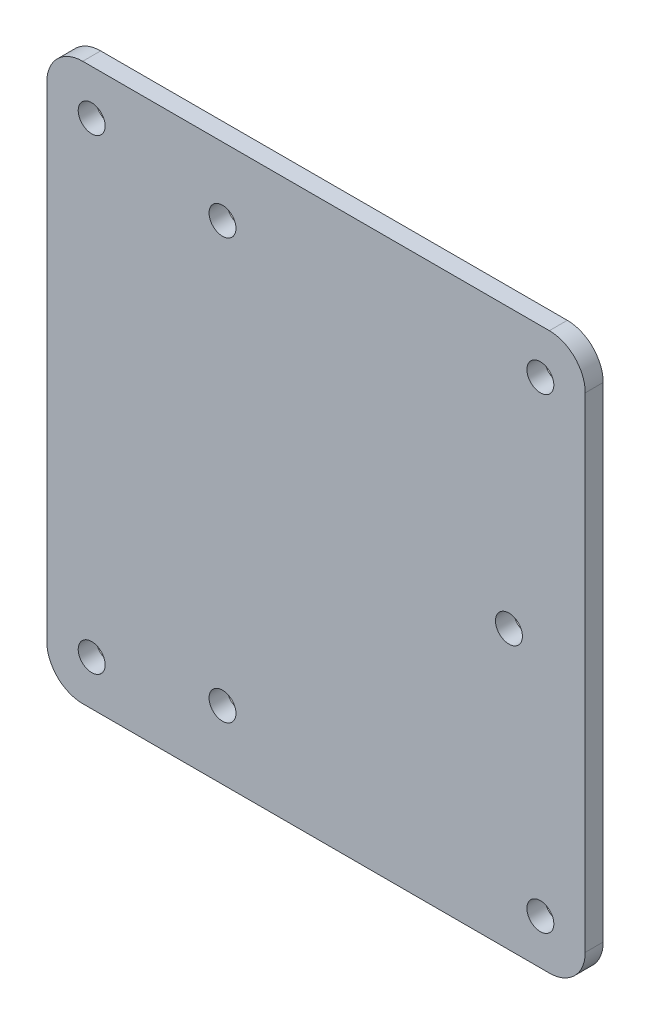
ISO-10303-21;
HEADER;
FILE_DESCRIPTION(('STEP AP214'),'2;1');
FILE_NAME('part.step','',(''),(''),'','','');
FILE_SCHEMA(('AUTOMOTIVE_DESIGN { 1 0 10303 214 1 1 1 1 }'));
ENDSEC;
DATA;
#1=APPLICATION_CONTEXT('core data for automotive mechanical design processes');
#2=APPLICATION_PROTOCOL_DEFINITION('international standard','automotive_design',2000,#1);
#3=PRODUCT_CONTEXT('',#1,'mechanical');
#4=PRODUCT('Part','Part','',(#3));
#5=PRODUCT_RELATED_PRODUCT_CATEGORY('part','',(#4));
#6=PRODUCT_DEFINITION_FORMATION('','',#4);
#7=PRODUCT_DEFINITION_CONTEXT('part definition',#1,'design');
#8=PRODUCT_DEFINITION('design','',#6,#7);
#9=PRODUCT_DEFINITION_SHAPE('','',#8);
#10=(LENGTH_UNIT() NAMED_UNIT(*) SI_UNIT(.MILLI.,.METRE.));
#11=(NAMED_UNIT(*) PLANE_ANGLE_UNIT() SI_UNIT($,.RADIAN.));
#12=(NAMED_UNIT(*) SI_UNIT($,.STERADIAN.) SOLID_ANGLE_UNIT());
#13=UNCERTAINTY_MEASURE_WITH_UNIT(LENGTH_MEASURE(1.E-05),#10,'distance_accuracy_value','');
#14=(GEOMETRIC_REPRESENTATION_CONTEXT(3) GLOBAL_UNCERTAINTY_ASSIGNED_CONTEXT((#13)) GLOBAL_UNIT_ASSIGNED_CONTEXT((#10,
#11,#12)) REPRESENTATION_CONTEXT('',''));
#15=CARTESIAN_POINT('',(0.,0.,0.));
#16=DIRECTION('',(0.,0.,1.));
#17=DIRECTION('',(1.,0.,0.));
#18=AXIS2_PLACEMENT_3D('',#15,#16,#17);
#19=CARTESIAN_POINT('',(0.,-31.,2.));
#20=DIRECTION('',(0.,-1.,0.));
#21=DIRECTION('',(1.,0.,0.));
#22=AXIS2_PLACEMENT_3D('',#19,#20,#21);
#23=PLANE('',#22);
#24=DIRECTION('',(-1.,0.,0.));
#25=VECTOR('',#24,1.);
#26=CARTESIAN_POINT('',(0.,-31.,2.));
#27=LINE('',#26,#25);
#28=CARTESIAN_POINT('',(26.,-31.,2.));
#29=VERTEX_POINT('',#28);
#30=CARTESIAN_POINT('',(-26.,-31.,2.));
#31=VERTEX_POINT('',#30);
#32=EDGE_CURVE('E163',#29,#31,#27,.T.);
#33=ORIENTED_EDGE('',*,*,#32,.T.);
#34=DIRECTION('',(0.,0.,-1.));
#35=VECTOR('',#34,1.);
#36=CARTESIAN_POINT('',(-26.,-31.,2.));
#37=LINE('',#36,#35);
#38=CARTESIAN_POINT('',(-26.,-31.,0.));
#39=VERTEX_POINT('',#38);
#40=EDGE_CURVE('E119',#31,#39,#37,.T.);
#41=ORIENTED_EDGE('',*,*,#40,.T.);
#42=DIRECTION('',(-1.,0.,0.));
#43=VECTOR('',#42,1.);
#44=CARTESIAN_POINT('',(0.,-31.,0.));
#45=LINE('',#44,#43);
#46=CARTESIAN_POINT('',(26.,-31.,0.));
#47=VERTEX_POINT('',#46);
#48=EDGE_CURVE('E109',#47,#39,#45,.T.);
#49=ORIENTED_EDGE('',*,*,#48,.F.);
#50=DIRECTION('',(0.,0.,-1.));
#51=VECTOR('',#50,1.);
#52=CARTESIAN_POINT('',(26.,-31.,2.));
#53=LINE('',#52,#51);
#54=EDGE_CURVE('E125',#47,#29,#53,.F.);
#55=ORIENTED_EDGE('',*,*,#54,.T.);
#56=EDGE_LOOP('',(#33,#41,#49,#55));
#57=FACE_BOUND('',#56,.T.);
#58=ADVANCED_FACE('F41',(#57),#23,.T.);
#59=CARTESIAN_POINT('',(30.,0.,2.));
#60=DIRECTION('',(-1.,0.,0.));
#61=DIRECTION('',(0.,0.,1.));
#62=AXIS2_PLACEMENT_3D('',#59,#60,#61);
#63=PLANE('',#62);
#64=DIRECTION('',(0.,1.,0.));
#65=VECTOR('',#64,1.);
#66=CARTESIAN_POINT('',(30.,0.,0.));
#67=LINE('',#66,#65);
#68=CARTESIAN_POINT('',(30.,-27.,0.));
#69=VERTEX_POINT('',#68);
#70=CARTESIAN_POINT('',(30.,27.,0.));
#71=VERTEX_POINT('',#70);
#72=EDGE_CURVE('E115',#69,#71,#67,.T.);
#73=ORIENTED_EDGE('',*,*,#72,.T.);
#74=DIRECTION('',(0.,0.,-1.));
#75=VECTOR('',#74,1.);
#76=CARTESIAN_POINT('',(30.,27.,2.));
#77=LINE('',#76,#75);
#78=CARTESIAN_POINT('',(30.,27.,2.));
#79=VERTEX_POINT('',#78);
#80=EDGE_CURVE('E11',#71,#79,#77,.F.);
#81=ORIENTED_EDGE('',*,*,#80,.T.);
#82=DIRECTION('',(0.,1.,0.));
#83=VECTOR('',#82,1.);
#84=CARTESIAN_POINT('',(30.,0.,2.));
#85=LINE('',#84,#83);
#86=CARTESIAN_POINT('',(30.,-27.,2.));
#87=VERTEX_POINT('',#86);
#88=EDGE_CURVE('E162',#87,#79,#85,.T.);
#89=ORIENTED_EDGE('',*,*,#88,.F.);
#90=DIRECTION('',(0.,0.,-1.));
#91=VECTOR('',#90,1.);
#92=CARTESIAN_POINT('',(30.,-27.,0.));
#93=LINE('',#92,#91);
#94=EDGE_CURVE('E47',#87,#69,#93,.T.);
#95=ORIENTED_EDGE('',*,*,#94,.T.);
#96=EDGE_LOOP('',(#73,#81,#89,#95));
#97=FACE_BOUND('',#96,.T.);
#98=ADVANCED_FACE('F161',(#97),#63,.F.);
#99=CARTESIAN_POINT('',(0.,31.,2.));
#100=DIRECTION('',(0.,-1.,0.));
#101=DIRECTION('',(1.,0.,0.));
#102=AXIS2_PLACEMENT_3D('',#99,#100,#101);
#103=PLANE('',#102);
#104=DIRECTION('',(-1.,0.,0.));
#105=VECTOR('',#104,1.);
#106=CARTESIAN_POINT('',(0.,31.,0.));
#107=LINE('',#106,#105);
#108=CARTESIAN_POINT('',(26.,31.,0.));
#109=VERTEX_POINT('',#108);
#110=CARTESIAN_POINT('',(-26.,31.,0.));
#111=VERTEX_POINT('',#110);
#112=EDGE_CURVE('E181',#109,#111,#107,.T.);
#113=ORIENTED_EDGE('',*,*,#112,.T.);
#114=DIRECTION('',(0.,0.,-1.));
#115=VECTOR('',#114,1.);
#116=CARTESIAN_POINT('',(-26.,31.,2.));
#117=LINE('',#116,#115);
#118=CARTESIAN_POINT('',(-26.,31.,2.));
#119=VERTEX_POINT('',#118);
#120=EDGE_CURVE('E57',#111,#119,#117,.F.);
#121=ORIENTED_EDGE('',*,*,#120,.T.);
#122=DIRECTION('',(-1.,0.,0.));
#123=VECTOR('',#122,1.);
#124=CARTESIAN_POINT('',(0.,31.,2.));
#125=LINE('',#124,#123);
#126=CARTESIAN_POINT('',(26.,31.,2.));
#127=VERTEX_POINT('',#126);
#128=EDGE_CURVE('E131',#127,#119,#125,.T.);
#129=ORIENTED_EDGE('',*,*,#128,.F.);
#130=DIRECTION('',(0.,0.,-1.));
#131=VECTOR('',#130,1.);
#132=CARTESIAN_POINT('',(26.,31.,2.));
#133=LINE('',#132,#131);
#134=EDGE_CURVE('E156',#127,#109,#133,.T.);
#135=ORIENTED_EDGE('',*,*,#134,.T.);
#136=EDGE_LOOP('',(#113,#121,#129,#135));
#137=FACE_BOUND('',#136,.T.);
#138=ADVANCED_FACE('F223',(#137),#103,.F.);
#139=CARTESIAN_POINT('',(-25.,26.,2.));
#140=DIRECTION('',(0.,0.,-1.));
#141=DIRECTION('',(-1.,0.,0.));
#142=AXIS2_PLACEMENT_3D('',#139,#140,#141);
#143=CYLINDRICAL_SURFACE('',#142,1.5);
#144=CARTESIAN_POINT('',(-25.,26.,2.));
#145=DIRECTION('',(0.,0.,1.));
#146=DIRECTION('',(1.,0.,0.));
#147=AXIS2_PLACEMENT_3D('',#144,#145,#146);
#148=CIRCLE('',#147,1.5);
#149=CARTESIAN_POINT('',(-23.5,26.,2.));
#150=VERTEX_POINT('',#149);
#151=EDGE_CURVE('E170',#150,#150,#148,.T.);
#152=ORIENTED_EDGE('',*,*,#151,.T.);
#153=EDGE_LOOP('',(#152));
#154=FACE_BOUND('',#153,.T.);
#155=CARTESIAN_POINT('',(-25.,26.,0.));
#156=DIRECTION('',(0.,0.,1.));
#157=DIRECTION('',(1.,0.,0.));
#158=AXIS2_PLACEMENT_3D('',#155,#156,#157);
#159=CIRCLE('',#158,1.5);
#160=CARTESIAN_POINT('',(-23.5,26.,0.));
#161=VERTEX_POINT('',#160);
#162=EDGE_CURVE('E127',#161,#161,#159,.T.);
#163=ORIENTED_EDGE('',*,*,#162,.F.);
#164=EDGE_LOOP('',(#163));
#165=FACE_BOUND('',#164,.T.);
#166=ADVANCED_FACE('F204',(#154,#165),#143,.F.);
#167=CARTESIAN_POINT('',(25.,26.,2.));
#168=DIRECTION('',(0.,0.,-1.));
#169=DIRECTION('',(-1.,0.,0.));
#170=AXIS2_PLACEMENT_3D('',#167,#168,#169);
#171=CYLINDRICAL_SURFACE('',#170,1.5);
#172=CARTESIAN_POINT('',(25.,26.,2.));
#173=DIRECTION('',(0.,0.,1.));
#174=DIRECTION('',(1.,0.,0.));
#175=AXIS2_PLACEMENT_3D('',#172,#173,#174);
#176=CIRCLE('',#175,1.5);
#177=CARTESIAN_POINT('',(26.5,26.,2.));
#178=VERTEX_POINT('',#177);
#179=EDGE_CURVE('E191',#178,#178,#176,.T.);
#180=ORIENTED_EDGE('',*,*,#179,.T.);
#181=EDGE_LOOP('',(#180));
#182=FACE_BOUND('',#181,.T.);
#183=CARTESIAN_POINT('',(25.,26.,0.));
#184=DIRECTION('',(0.,0.,1.));
#185=DIRECTION('',(1.,0.,0.));
#186=AXIS2_PLACEMENT_3D('',#183,#184,#185);
#187=CIRCLE('',#186,1.5);
#188=CARTESIAN_POINT('',(26.5,26.,0.));
#189=VERTEX_POINT('',#188);
#190=EDGE_CURVE('E180',#189,#189,#187,.T.);
#191=ORIENTED_EDGE('',*,*,#190,.F.);
#192=EDGE_LOOP('',(#191));
#193=FACE_BOUND('',#192,.T.);
#194=ADVANCED_FACE('F235',(#182,#193),#171,.F.);
#195=CARTESIAN_POINT('',(25.,-26.,2.));
#196=DIRECTION('',(0.,0.,-1.));
#197=DIRECTION('',(-1.,0.,0.));
#198=AXIS2_PLACEMENT_3D('',#195,#196,#197);
#199=CYLINDRICAL_SURFACE('',#198,1.5);
#200=CARTESIAN_POINT('',(25.,-26.,2.));
#201=DIRECTION('',(0.,0.,1.));
#202=DIRECTION('',(1.,0.,0.));
#203=AXIS2_PLACEMENT_3D('',#200,#201,#202);
#204=CIRCLE('',#203,1.5);
#205=CARTESIAN_POINT('',(26.5,-26.,2.));
#206=VERTEX_POINT('',#205);
#207=EDGE_CURVE('E186',#206,#206,#204,.T.);
#208=ORIENTED_EDGE('',*,*,#207,.T.);
#209=EDGE_LOOP('',(#208));
#210=FACE_BOUND('',#209,.T.);
#211=CARTESIAN_POINT('',(25.,-26.,0.));
#212=DIRECTION('',(0.,0.,1.));
#213=DIRECTION('',(1.,0.,0.));
#214=AXIS2_PLACEMENT_3D('',#211,#212,#213);
#215=CIRCLE('',#214,1.5);
#216=CARTESIAN_POINT('',(26.5,-26.,0.));
#217=VERTEX_POINT('',#216);
#218=EDGE_CURVE('E171',#217,#217,#215,.T.);
#219=ORIENTED_EDGE('',*,*,#218,.F.);
#220=EDGE_LOOP('',(#219));
#221=FACE_BOUND('',#220,.T.);
#222=ADVANCED_FACE('F243',(#210,#221),#199,.F.);
#223=CARTESIAN_POINT('',(-25.,-26.,2.));
#224=DIRECTION('',(0.,0.,-1.));
#225=DIRECTION('',(-1.,0.,0.));
#226=AXIS2_PLACEMENT_3D('',#223,#224,#225);
#227=CYLINDRICAL_SURFACE('',#226,1.5);
#228=CARTESIAN_POINT('',(-25.,-26.,2.));
#229=DIRECTION('',(0.,0.,1.));
#230=DIRECTION('',(1.,0.,0.));
#231=AXIS2_PLACEMENT_3D('',#228,#229,#230);
#232=CIRCLE('',#231,1.5);
#233=CARTESIAN_POINT('',(-23.5,-26.,2.));
#234=VERTEX_POINT('',#233);
#235=EDGE_CURVE('E187',#234,#234,#232,.T.);
#236=ORIENTED_EDGE('',*,*,#235,.T.);
#237=EDGE_LOOP('',(#236));
#238=FACE_BOUND('',#237,.T.);
#239=CARTESIAN_POINT('',(-25.,-26.,0.));
#240=DIRECTION('',(0.,0.,1.));
#241=DIRECTION('',(1.,0.,0.));
#242=AXIS2_PLACEMENT_3D('',#239,#240,#241);
#243=CIRCLE('',#242,1.5);
#244=CARTESIAN_POINT('',(-23.5,-26.,0.));
#245=VERTEX_POINT('',#244);
#246=EDGE_CURVE('E172',#245,#245,#243,.T.);
#247=ORIENTED_EDGE('',*,*,#246,.F.);
#248=EDGE_LOOP('',(#247));
#249=FACE_BOUND('',#248,.T.);
#250=ADVANCED_FACE('F246',(#238,#249),#227,.F.);
#251=CARTESIAN_POINT('',(-30.,0.,2.));
#252=DIRECTION('',(-1.,0.,0.));
#253=DIRECTION('',(0.,-1.,0.));
#254=AXIS2_PLACEMENT_3D('',#251,#252,#253);
#255=PLANE('',#254);
#256=DIRECTION('',(0.,1.,0.));
#257=VECTOR('',#256,1.);
#258=CARTESIAN_POINT('',(-30.,0.,0.));
#259=LINE('',#258,#257);
#260=CARTESIAN_POINT('',(-30.,-27.,0.));
#261=VERTEX_POINT('',#260);
#262=CARTESIAN_POINT('',(-30.,27.,0.));
#263=VERTEX_POINT('',#262);
#264=EDGE_CURVE('E139',#261,#263,#259,.T.);
#265=ORIENTED_EDGE('',*,*,#264,.F.);
#266=DIRECTION('',(0.,0.,-1.));
#267=VECTOR('',#266,1.);
#268=CARTESIAN_POINT('',(-30.,-27.,2.));
#269=LINE('',#268,#267);
#270=CARTESIAN_POINT('',(-30.,-27.,2.));
#271=VERTEX_POINT('',#270);
#272=EDGE_CURVE('E146',#261,#271,#269,.F.);
#273=ORIENTED_EDGE('',*,*,#272,.T.);
#274=DIRECTION('',(0.,1.,0.));
#275=VECTOR('',#274,1.);
#276=CARTESIAN_POINT('',(-30.,0.,2.));
#277=LINE('',#276,#275);
#278=CARTESIAN_POINT('',(-30.,27.,2.));
#279=VERTEX_POINT('',#278);
#280=EDGE_CURVE('E128',#271,#279,#277,.T.);
#281=ORIENTED_EDGE('',*,*,#280,.T.);
#282=DIRECTION('',(0.,0.,-1.));
#283=VECTOR('',#282,1.);
#284=CARTESIAN_POINT('',(-30.,27.,0.));
#285=LINE('',#284,#283);
#286=EDGE_CURVE('E144',#279,#263,#285,.T.);
#287=ORIENTED_EDGE('',*,*,#286,.T.);
#288=EDGE_LOOP('',(#265,#273,#281,#287));
#289=FACE_BOUND('',#288,.T.);
#290=ADVANCED_FACE('F207',(#289),#255,.T.);
#291=CARTESIAN_POINT('',(0.,0.,2.));
#292=DIRECTION('',(0.,0.,1.));
#293=DIRECTION('',(1.,0.,0.));
#294=AXIS2_PLACEMENT_3D('',#291,#292,#293);
#295=PLANE('',#294);
#296=CARTESIAN_POINT('',(21.5,0.,2.));
#297=DIRECTION('',(0.,0.,1.));
#298=DIRECTION('',(1.,0.,0.));
#299=AXIS2_PLACEMENT_3D('',#296,#297,#298);
#300=CIRCLE('',#299,1.5);
#301=CARTESIAN_POINT('',(23.,0.,2.));
#302=VERTEX_POINT('',#301);
#303=EDGE_CURVE('E327',#302,#302,#300,.T.);
#304=ORIENTED_EDGE('',*,*,#303,.F.);
#305=EDGE_LOOP('',(#304));
#306=FACE_BOUND('',#305,.T.);
#307=CARTESIAN_POINT('',(-10.42,23.4,2.));
#308=DIRECTION('',(0.,0.,1.));
#309=DIRECTION('',(1.,0.,0.));
#310=AXIS2_PLACEMENT_3D('',#307,#308,#309);
#311=CIRCLE('',#310,1.5);
#312=CARTESIAN_POINT('',(-8.92,23.4,2.));
#313=VERTEX_POINT('',#312);
#314=EDGE_CURVE('E328',#313,#313,#311,.T.);
#315=ORIENTED_EDGE('',*,*,#314,.F.);
#316=EDGE_LOOP('',(#315));
#317=FACE_BOUND('',#316,.T.);
#318=CARTESIAN_POINT('',(-10.42,-23.4,2.));
#319=DIRECTION('',(0.,0.,1.));
#320=DIRECTION('',(1.,0.,0.));
#321=AXIS2_PLACEMENT_3D('',#318,#319,#320);
#322=CIRCLE('',#321,1.5);
#323=CARTESIAN_POINT('',(-8.91999999999999,-23.4,2.));
#324=VERTEX_POINT('',#323);
#325=EDGE_CURVE('E340',#324,#324,#322,.T.);
#326=ORIENTED_EDGE('',*,*,#325,.F.);
#327=EDGE_LOOP('',(#326));
#328=FACE_BOUND('',#327,.T.);
#329=ORIENTED_EDGE('',*,*,#235,.F.);
#330=EDGE_LOOP('',(#329));
#331=FACE_BOUND('',#330,.T.);
#332=ORIENTED_EDGE('',*,*,#207,.F.);
#333=EDGE_LOOP('',(#332));
#334=FACE_BOUND('',#333,.T.);
#335=ORIENTED_EDGE('',*,*,#179,.F.);
#336=EDGE_LOOP('',(#335));
#337=FACE_BOUND('',#336,.T.);
#338=ORIENTED_EDGE('',*,*,#151,.F.);
#339=EDGE_LOOP('',(#338));
#340=FACE_BOUND('',#339,.T.);
#341=ORIENTED_EDGE('',*,*,#280,.F.);
#342=CARTESIAN_POINT('',(-26.,-27.,2.));
#343=DIRECTION('',(0.,0.,1.));
#344=DIRECTION('',(1.,0.,0.));
#345=AXIS2_PLACEMENT_3D('',#342,#343,#344);
#346=CIRCLE('',#345,4.);
#347=EDGE_CURVE('E152',#271,#31,#346,.T.);
#348=ORIENTED_EDGE('',*,*,#347,.T.);
#349=ORIENTED_EDGE('',*,*,#32,.F.);
#350=CARTESIAN_POINT('',(26.,-27.,2.));
#351=DIRECTION('',(0.,0.,1.));
#352=DIRECTION('',(1.,0.,0.));
#353=AXIS2_PLACEMENT_3D('',#350,#351,#352);
#354=CIRCLE('',#353,4.);
#355=EDGE_CURVE('E129',#29,#87,#354,.T.);
#356=ORIENTED_EDGE('',*,*,#355,.T.);
#357=ORIENTED_EDGE('',*,*,#88,.T.);
#358=CARTESIAN_POINT('',(26.,27.,2.));
#359=DIRECTION('',(0.,0.,1.));
#360=DIRECTION('',(1.,0.,0.));
#361=AXIS2_PLACEMENT_3D('',#358,#359,#360);
#362=CIRCLE('',#361,4.);
#363=EDGE_CURVE('E64',#79,#127,#362,.T.);
#364=ORIENTED_EDGE('',*,*,#363,.T.);
#365=ORIENTED_EDGE('',*,*,#128,.T.);
#366=CARTESIAN_POINT('',(-26.,27.,2.));
#367=DIRECTION('',(0.,0.,1.));
#368=DIRECTION('',(1.,0.,0.));
#369=AXIS2_PLACEMENT_3D('',#366,#367,#368);
#370=CIRCLE('',#369,4.);
#371=EDGE_CURVE('E155',#119,#279,#370,.T.);
#372=ORIENTED_EDGE('',*,*,#371,.T.);
#373=EDGE_LOOP('',(#341,#348,#349,#356,#357,#364,#365,#372));
#374=FACE_BOUND('',#373,.T.);
#375=ADVANCED_FACE('F210',(#306,#317,#328,#331,#334,#337,#340,#374),#295,.T.);
#376=CARTESIAN_POINT('',(0.,0.,0.));
#377=DIRECTION('',(0.,0.,1.));
#378=DIRECTION('',(1.,0.,0.));
#379=AXIS2_PLACEMENT_3D('',#376,#377,#378);
#380=PLANE('',#379);
#381=CARTESIAN_POINT('',(21.5,0.,0.));
#382=DIRECTION('',(0.,0.,1.));
#383=DIRECTION('',(1.,0.,0.));
#384=AXIS2_PLACEMENT_3D('',#381,#382,#383);
#385=CIRCLE('',#384,1.5);
#386=CARTESIAN_POINT('',(23.,0.,0.));
#387=VERTEX_POINT('',#386);
#388=EDGE_CURVE('E173',#387,#387,#385,.T.);
#389=ORIENTED_EDGE('',*,*,#388,.T.);
#390=EDGE_LOOP('',(#389));
#391=FACE_BOUND('',#390,.T.);
#392=CARTESIAN_POINT('',(-10.42,23.4,0.));
#393=DIRECTION('',(0.,0.,1.));
#394=DIRECTION('',(1.,0.,0.));
#395=AXIS2_PLACEMENT_3D('',#392,#393,#394);
#396=CIRCLE('',#395,1.5);
#397=CARTESIAN_POINT('',(-8.92,23.4,0.));
#398=VERTEX_POINT('',#397);
#399=EDGE_CURVE('E334',#398,#398,#396,.T.);
#400=ORIENTED_EDGE('',*,*,#399,.T.);
#401=EDGE_LOOP('',(#400));
#402=FACE_BOUND('',#401,.T.);
#403=CARTESIAN_POINT('',(-10.42,-23.4,0.));
#404=DIRECTION('',(0.,0.,1.));
#405=DIRECTION('',(1.,0.,0.));
#406=AXIS2_PLACEMENT_3D('',#403,#404,#405);
#407=CIRCLE('',#406,1.5);
#408=CARTESIAN_POINT('',(-8.91999999999999,-23.4,0.));
#409=VERTEX_POINT('',#408);
#410=EDGE_CURVE('E197',#409,#409,#407,.T.);
#411=ORIENTED_EDGE('',*,*,#410,.T.);
#412=EDGE_LOOP('',(#411));
#413=FACE_BOUND('',#412,.T.);
#414=ORIENTED_EDGE('',*,*,#246,.T.);
#415=EDGE_LOOP('',(#414));
#416=FACE_BOUND('',#415,.T.);
#417=ORIENTED_EDGE('',*,*,#218,.T.);
#418=EDGE_LOOP('',(#417));
#419=FACE_BOUND('',#418,.T.);
#420=ORIENTED_EDGE('',*,*,#190,.T.);
#421=EDGE_LOOP('',(#420));
#422=FACE_BOUND('',#421,.T.);
#423=ORIENTED_EDGE('',*,*,#162,.T.);
#424=EDGE_LOOP('',(#423));
#425=FACE_BOUND('',#424,.T.);
#426=ORIENTED_EDGE('',*,*,#48,.T.);
#427=CARTESIAN_POINT('',(-26.,-27.,0.));
#428=DIRECTION('',(0.,0.,1.));
#429=DIRECTION('',(1.,0.,0.));
#430=AXIS2_PLACEMENT_3D('',#427,#428,#429);
#431=CIRCLE('',#430,4.);
#432=EDGE_CURVE('E141',#39,#261,#431,.F.);
#433=ORIENTED_EDGE('',*,*,#432,.T.);
#434=ORIENTED_EDGE('',*,*,#264,.T.);
#435=CARTESIAN_POINT('',(-26.,27.,0.));
#436=DIRECTION('',(0.,0.,1.));
#437=DIRECTION('',(1.,0.,0.));
#438=AXIS2_PLACEMENT_3D('',#435,#436,#437);
#439=CIRCLE('',#438,4.);
#440=EDGE_CURVE('E143',#263,#111,#439,.F.);
#441=ORIENTED_EDGE('',*,*,#440,.T.);
#442=ORIENTED_EDGE('',*,*,#112,.F.);
#443=CARTESIAN_POINT('',(26.,27.,0.));
#444=DIRECTION('',(0.,0.,1.));
#445=DIRECTION('',(1.,0.,0.));
#446=AXIS2_PLACEMENT_3D('',#443,#444,#445);
#447=CIRCLE('',#446,4.);
#448=EDGE_CURVE('E120',#109,#71,#447,.F.);
#449=ORIENTED_EDGE('',*,*,#448,.T.);
#450=ORIENTED_EDGE('',*,*,#72,.F.);
#451=CARTESIAN_POINT('',(26.,-27.,0.));
#452=DIRECTION('',(0.,0.,1.));
#453=DIRECTION('',(1.,0.,0.));
#454=AXIS2_PLACEMENT_3D('',#451,#452,#453);
#455=CIRCLE('',#454,4.);
#456=EDGE_CURVE('E110',#69,#47,#455,.F.);
#457=ORIENTED_EDGE('',*,*,#456,.T.);
#458=EDGE_LOOP('',(#426,#433,#434,#441,#442,#449,#450,#457));
#459=FACE_BOUND('',#458,.T.);
#460=ADVANCED_FACE('F108',(#391,#402,#413,#416,#419,#422,#425,#459),#380,.F.);
#461=CARTESIAN_POINT('',(-26.,-27.,2.));
#462=DIRECTION('',(0.,0.,-1.));
#463=DIRECTION('',(-1.,0.,0.));
#464=AXIS2_PLACEMENT_3D('',#461,#462,#463);
#465=CYLINDRICAL_SURFACE('',#464,4.);
#466=ORIENTED_EDGE('',*,*,#347,.F.);
#467=ORIENTED_EDGE('',*,*,#272,.F.);
#468=ORIENTED_EDGE('',*,*,#432,.F.);
#469=ORIENTED_EDGE('',*,*,#40,.F.);
#470=EDGE_LOOP('',(#466,#467,#468,#469));
#471=FACE_BOUND('',#470,.T.);
#472=ADVANCED_FACE('F218',(#471),#465,.T.);
#473=CARTESIAN_POINT('',(-26.,27.,2.));
#474=DIRECTION('',(0.,0.,1.));
#475=DIRECTION('',(1.,0.,0.));
#476=AXIS2_PLACEMENT_3D('',#473,#474,#475);
#477=CYLINDRICAL_SURFACE('',#476,4.);
#478=ORIENTED_EDGE('',*,*,#371,.F.);
#479=ORIENTED_EDGE('',*,*,#120,.F.);
#480=ORIENTED_EDGE('',*,*,#440,.F.);
#481=ORIENTED_EDGE('',*,*,#286,.F.);
#482=EDGE_LOOP('',(#478,#479,#480,#481));
#483=FACE_BOUND('',#482,.T.);
#484=ADVANCED_FACE('F222',(#483),#477,.T.);
#485=CARTESIAN_POINT('',(26.,27.,2.));
#486=DIRECTION('',(0.,0.,-1.));
#487=DIRECTION('',(-1.,0.,0.));
#488=AXIS2_PLACEMENT_3D('',#485,#486,#487);
#489=CYLINDRICAL_SURFACE('',#488,4.);
#490=ORIENTED_EDGE('',*,*,#363,.F.);
#491=ORIENTED_EDGE('',*,*,#80,.F.);
#492=ORIENTED_EDGE('',*,*,#448,.F.);
#493=ORIENTED_EDGE('',*,*,#134,.F.);
#494=EDGE_LOOP('',(#490,#491,#492,#493));
#495=FACE_BOUND('',#494,.T.);
#496=ADVANCED_FACE('F221',(#495),#489,.T.);
#497=CARTESIAN_POINT('',(26.,-27.,2.));
#498=DIRECTION('',(0.,0.,1.));
#499=DIRECTION('',(1.,0.,0.));
#500=AXIS2_PLACEMENT_3D('',#497,#498,#499);
#501=CYLINDRICAL_SURFACE('',#500,4.);
#502=ORIENTED_EDGE('',*,*,#355,.F.);
#503=ORIENTED_EDGE('',*,*,#54,.F.);
#504=ORIENTED_EDGE('',*,*,#456,.F.);
#505=ORIENTED_EDGE('',*,*,#94,.F.);
#506=EDGE_LOOP('',(#502,#503,#504,#505));
#507=FACE_BOUND('',#506,.T.);
#508=ADVANCED_FACE('F43',(#507),#501,.T.);
#509=CARTESIAN_POINT('',(-10.42,-23.4,0.));
#510=DIRECTION('',(0.,0.,1.));
#511=DIRECTION('',(1.,0.,0.));
#512=AXIS2_PLACEMENT_3D('',#509,#510,#511);
#513=CYLINDRICAL_SURFACE('',#512,1.5);
#514=ORIENTED_EDGE('',*,*,#410,.F.);
#515=EDGE_LOOP('',(#514));
#516=FACE_BOUND('',#515,.T.);
#517=ORIENTED_EDGE('',*,*,#325,.T.);
#518=EDGE_LOOP('',(#517));
#519=FACE_BOUND('',#518,.T.);
#520=ADVANCED_FACE('F259',(#516,#519),#513,.F.);
#521=CARTESIAN_POINT('',(-10.42,23.4,0.));
#522=DIRECTION('',(0.,0.,1.));
#523=DIRECTION('',(1.,0.,0.));
#524=AXIS2_PLACEMENT_3D('',#521,#522,#523);
#525=CYLINDRICAL_SURFACE('',#524,1.5);
#526=ORIENTED_EDGE('',*,*,#399,.F.);
#527=EDGE_LOOP('',(#526));
#528=FACE_BOUND('',#527,.T.);
#529=ORIENTED_EDGE('',*,*,#314,.T.);
#530=EDGE_LOOP('',(#529));
#531=FACE_BOUND('',#530,.T.);
#532=ADVANCED_FACE('F263',(#528,#531),#525,.F.);
#533=CARTESIAN_POINT('',(21.5,0.,0.));
#534=DIRECTION('',(0.,0.,1.));
#535=DIRECTION('',(1.,0.,0.));
#536=AXIS2_PLACEMENT_3D('',#533,#534,#535);
#537=CYLINDRICAL_SURFACE('',#536,1.5);
#538=ORIENTED_EDGE('',*,*,#388,.F.);
#539=EDGE_LOOP('',(#538));
#540=FACE_BOUND('',#539,.T.);
#541=ORIENTED_EDGE('',*,*,#303,.T.);
#542=EDGE_LOOP('',(#541));
#543=FACE_BOUND('',#542,.T.);
#544=ADVANCED_FACE('F269',(#540,#543),#537,.F.);
#545=CLOSED_SHELL('',(#58,#98,#138,#166,#194,#222,#250,#290,#375,#460,#472,#484,#496,#508,#520,
#532,#544));
#546=MANIFOLD_SOLID_BREP('B2',#545);
#547=ADVANCED_BREP_SHAPE_REPRESENTATION('',(#18,#546),#14);
#548=SHAPE_DEFINITION_REPRESENTATION(#9,#547);
ENDSEC;
END-ISO-10303-21;
